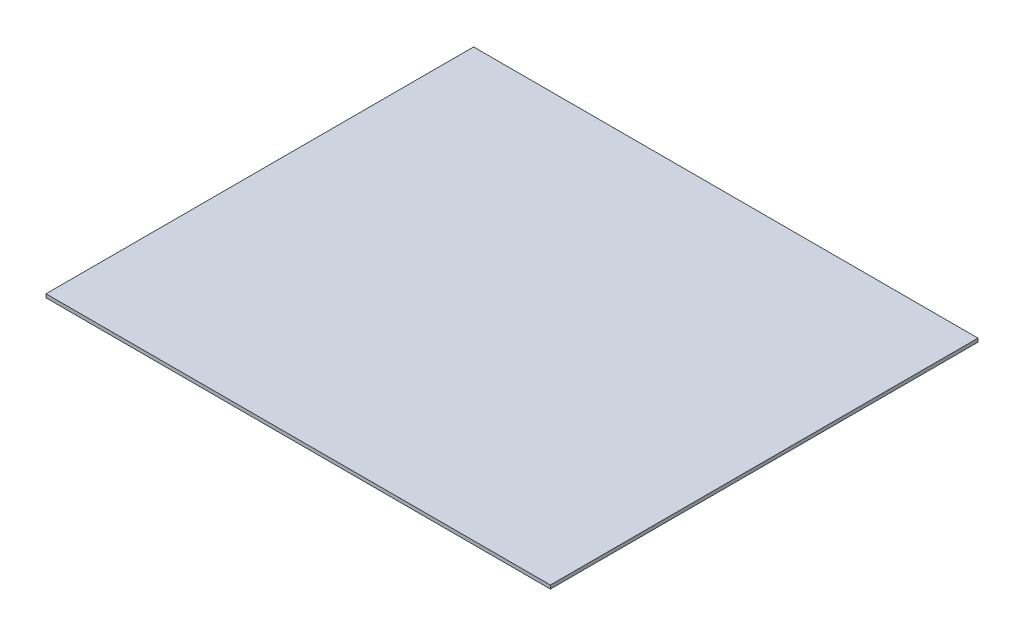
ISO-10303-21;
HEADER;
FILE_DESCRIPTION(('STEP AP214'),'2;1');
FILE_NAME('part.step','',(''),(''),'','','');
FILE_SCHEMA(('AUTOMOTIVE_DESIGN { 1 0 10303 214 1 1 1 1 }'));
ENDSEC;
DATA;
#1=APPLICATION_CONTEXT('core data for automotive mechanical design processes');
#2=APPLICATION_PROTOCOL_DEFINITION('international standard','automotive_design',2000,#1);
#3=PRODUCT_CONTEXT('',#1,'mechanical');
#4=PRODUCT('Part','Part','',(#3));
#5=PRODUCT_RELATED_PRODUCT_CATEGORY('part','',(#4));
#6=PRODUCT_DEFINITION_FORMATION('','',#4);
#7=PRODUCT_DEFINITION_CONTEXT('part definition',#1,'design');
#8=PRODUCT_DEFINITION('design','',#6,#7);
#9=PRODUCT_DEFINITION_SHAPE('','',#8);
#10=(LENGTH_UNIT() NAMED_UNIT(*) SI_UNIT(.MILLI.,.METRE.));
#11=(NAMED_UNIT(*) PLANE_ANGLE_UNIT() SI_UNIT($,.RADIAN.));
#12=(NAMED_UNIT(*) SI_UNIT($,.STERADIAN.) SOLID_ANGLE_UNIT());
#13=UNCERTAINTY_MEASURE_WITH_UNIT(LENGTH_MEASURE(1.E-05),#10,'distance_accuracy_value','');
#14=(GEOMETRIC_REPRESENTATION_CONTEXT(3) GLOBAL_UNCERTAINTY_ASSIGNED_CONTEXT((#13)) GLOBAL_UNIT_ASSIGNED_CONTEXT((#10,
#11,#12)) REPRESENTATION_CONTEXT('',''));
#15=CARTESIAN_POINT('',(0.,0.,0.));
#16=DIRECTION('',(0.,0.,1.));
#17=DIRECTION('',(1.,0.,0.));
#18=AXIS2_PLACEMENT_3D('',#15,#16,#17);
#19=CARTESIAN_POINT('',(-7.56785548459685,14.1207339864429,13.2121278684956));
#20=DIRECTION('',(0.,0.,-1.));
#21=DIRECTION('',(-1.,0.,0.));
#22=AXIS2_PLACEMENT_3D('',#19,#20,#21);
#23=PLANE('',#22);
#24=DIRECTION('',(-1.,0.,0.));
#25=VECTOR('',#24,1.);
#26=CARTESIAN_POINT('',(-7.56785548459685,14.579155190141,13.2121278684956));
#27=LINE('',#26,#25);
#28=CARTESIAN_POINT('',(-7.56785548459685,14.579155190141,13.2121278684956));
#29=VERTEX_POINT('',#28);
#30=CARTESIAN_POINT('',(-73.2426091978335,14.579155190141,13.2121278684956));
#31=VERTEX_POINT('',#30);
#32=EDGE_CURVE('E79',#29,#31,#27,.T.);
#33=ORIENTED_EDGE('',*,*,#32,.F.);
#34=DIRECTION('',(0.,1.,0.));
#35=VECTOR('',#34,1.);
#36=CARTESIAN_POINT('',(-7.56785548459685,14.1207339864429,13.2121278684956));
#37=LINE('',#36,#35);
#38=CARTESIAN_POINT('',(-7.56785548459685,14.1207339864429,13.2121278684956));
#39=VERTEX_POINT('',#38);
#40=EDGE_CURVE('E32',#39,#29,#37,.T.);
#41=ORIENTED_EDGE('',*,*,#40,.F.);
#42=DIRECTION('',(-1.,0.,0.));
#43=VECTOR('',#42,1.);
#44=CARTESIAN_POINT('',(-7.56785548459685,14.1207339864429,13.2121278684956));
#45=LINE('',#44,#43);
#46=CARTESIAN_POINT('',(-73.2426091978335,14.1207339864429,13.2121278684956));
#47=VERTEX_POINT('',#46);
#48=EDGE_CURVE('E71',#39,#47,#45,.T.);
#49=ORIENTED_EDGE('',*,*,#48,.T.);
#50=DIRECTION('',(0.,1.,0.));
#51=VECTOR('',#50,1.);
#52=CARTESIAN_POINT('',(-73.2426091978335,14.1207339864429,13.2121278684956));
#53=LINE('',#52,#51);
#54=EDGE_CURVE('E10',#47,#31,#53,.T.);
#55=ORIENTED_EDGE('',*,*,#54,.T.);
#56=EDGE_LOOP('',(#33,#41,#49,#55));
#57=FACE_BOUND('',#56,.T.);
#58=ADVANCED_FACE('F16',(#57),#23,.T.);
#59=CARTESIAN_POINT('',(-73.2426091978335,14.1207339864429,13.2121278684956));
#60=DIRECTION('',(-1.,0.,0.));
#61=DIRECTION('',(0.,0.,1.));
#62=AXIS2_PLACEMENT_3D('',#59,#60,#61);
#63=PLANE('',#62);
#64=DIRECTION('',(0.,0.,1.));
#65=VECTOR('',#64,1.);
#66=CARTESIAN_POINT('',(-73.2426091978335,14.579155190141,13.2121278684956));
#67=LINE('',#66,#65);
#68=CARTESIAN_POINT('',(-73.2426091978335,14.579155190141,68.8868815817323));
#69=VERTEX_POINT('',#68);
#70=EDGE_CURVE('E82',#31,#69,#67,.T.);
#71=ORIENTED_EDGE('',*,*,#70,.F.);
#72=ORIENTED_EDGE('',*,*,#54,.F.);
#73=DIRECTION('',(0.,0.,1.));
#74=VECTOR('',#73,1.);
#75=CARTESIAN_POINT('',(-73.2426091978335,14.1207339864429,13.2121278684956));
#76=LINE('',#75,#74);
#77=CARTESIAN_POINT('',(-73.2426091978335,14.1207339864429,68.8868815817323));
#78=VERTEX_POINT('',#77);
#79=EDGE_CURVE('E67',#47,#78,#76,.T.);
#80=ORIENTED_EDGE('',*,*,#79,.T.);
#81=DIRECTION('',(0.,1.,0.));
#82=VECTOR('',#81,1.);
#83=CARTESIAN_POINT('',(-73.2426091978335,14.1207339864429,68.8868815817323));
#84=LINE('',#83,#82);
#85=EDGE_CURVE('E24',#78,#69,#84,.T.);
#86=ORIENTED_EDGE('',*,*,#85,.T.);
#87=EDGE_LOOP('',(#71,#72,#80,#86));
#88=FACE_BOUND('',#87,.T.);
#89=ADVANCED_FACE('F68',(#88),#63,.T.);
#90=CARTESIAN_POINT('',(-73.2426091978335,14.1207339864429,68.8868815817323));
#91=DIRECTION('',(0.,0.,1.));
#92=DIRECTION('',(1.,0.,0.));
#93=AXIS2_PLACEMENT_3D('',#90,#91,#92);
#94=PLANE('',#93);
#95=DIRECTION('',(1.,0.,0.));
#96=VECTOR('',#95,1.);
#97=CARTESIAN_POINT('',(-73.2426091978335,14.579155190141,68.8868815817323));
#98=LINE('',#97,#96);
#99=CARTESIAN_POINT('',(-7.56785548459686,14.579155190141,68.8868815817323));
#100=VERTEX_POINT('',#99);
#101=EDGE_CURVE('E65',#69,#100,#98,.T.);
#102=ORIENTED_EDGE('',*,*,#101,.F.);
#103=ORIENTED_EDGE('',*,*,#85,.F.);
#104=DIRECTION('',(1.,0.,0.));
#105=VECTOR('',#104,1.);
#106=CARTESIAN_POINT('',(-73.2426091978335,14.1207339864429,68.8868815817323));
#107=LINE('',#106,#105);
#108=CARTESIAN_POINT('',(-7.56785548459686,14.1207339864429,68.8868815817323));
#109=VERTEX_POINT('',#108);
#110=EDGE_CURVE('E62',#78,#109,#107,.T.);
#111=ORIENTED_EDGE('',*,*,#110,.T.);
#112=DIRECTION('',(0.,1.,0.));
#113=VECTOR('',#112,1.);
#114=CARTESIAN_POINT('',(-7.56785548459686,14.1207339864429,68.8868815817323));
#115=LINE('',#114,#113);
#116=EDGE_CURVE('E48',#109,#100,#115,.T.);
#117=ORIENTED_EDGE('',*,*,#116,.T.);
#118=EDGE_LOOP('',(#102,#103,#111,#117));
#119=FACE_BOUND('',#118,.T.);
#120=ADVANCED_FACE('F60',(#119),#94,.T.);
#121=CARTESIAN_POINT('',(-7.56785548459685,14.1207339864429,68.8868815817323));
#122=DIRECTION('',(1.,0.,0.));
#123=DIRECTION('',(0.,0.,-1.));
#124=AXIS2_PLACEMENT_3D('',#121,#122,#123);
#125=PLANE('',#124);
#126=DIRECTION('',(0.,0.,-1.));
#127=VECTOR('',#126,1.);
#128=CARTESIAN_POINT('',(-7.56785548459685,14.579155190141,68.8868815817323));
#129=LINE('',#128,#127);
#130=EDGE_CURVE('E85',#100,#29,#129,.T.);
#131=ORIENTED_EDGE('',*,*,#130,.F.);
#132=ORIENTED_EDGE('',*,*,#116,.F.);
#133=DIRECTION('',(0.,0.,-1.));
#134=VECTOR('',#133,1.);
#135=CARTESIAN_POINT('',(-7.56785548459685,14.1207339864429,68.8868815817323));
#136=LINE('',#135,#134);
#137=EDGE_CURVE('E74',#109,#39,#136,.T.);
#138=ORIENTED_EDGE('',*,*,#137,.T.);
#139=ORIENTED_EDGE('',*,*,#40,.T.);
#140=EDGE_LOOP('',(#131,#132,#138,#139));
#141=FACE_BOUND('',#140,.T.);
#142=ADVANCED_FACE('F96',(#141),#125,.T.);
#143=CARTESIAN_POINT('',(-40.4052323412152,14.1207339864429,14.0495047251139));
#144=DIRECTION('',(0.,1.,0.));
#145=DIRECTION('',(-1.,0.,0.));
#146=AXIS2_PLACEMENT_3D('',#143,#144,#145);
#147=PLANE('',#146);
#148=ORIENTED_EDGE('',*,*,#48,.F.);
#149=ORIENTED_EDGE('',*,*,#137,.F.);
#150=ORIENTED_EDGE('',*,*,#110,.F.);
#151=ORIENTED_EDGE('',*,*,#79,.F.);
#152=EDGE_LOOP('',(#148,#149,#150,#151));
#153=FACE_BOUND('',#152,.T.);
#154=ADVANCED_FACE('F73',(#153),#147,.F.);
#155=CARTESIAN_POINT('',(-40.4052323412152,14.579155190141,14.0495047251139));
#156=DIRECTION('',(0.,1.,0.));
#157=DIRECTION('',(-1.,0.,0.));
#158=AXIS2_PLACEMENT_3D('',#155,#156,#157);
#159=PLANE('',#158);
#160=ORIENTED_EDGE('',*,*,#32,.T.);
#161=ORIENTED_EDGE('',*,*,#70,.T.);
#162=ORIENTED_EDGE('',*,*,#101,.T.);
#163=ORIENTED_EDGE('',*,*,#130,.T.);
#164=EDGE_LOOP('',(#160,#161,#162,#163));
#165=FACE_BOUND('',#164,.T.);
#166=ADVANCED_FACE('F89',(#165),#159,.T.);
#167=CLOSED_SHELL('',(#58,#89,#120,#142,#154,#166));
#168=MANIFOLD_SOLID_BREP('B1',#167);
#169=ADVANCED_BREP_SHAPE_REPRESENTATION('',(#18,#168),#14);
#170=SHAPE_DEFINITION_REPRESENTATION(#9,#169);
ENDSEC;
END-ISO-10303-21;
